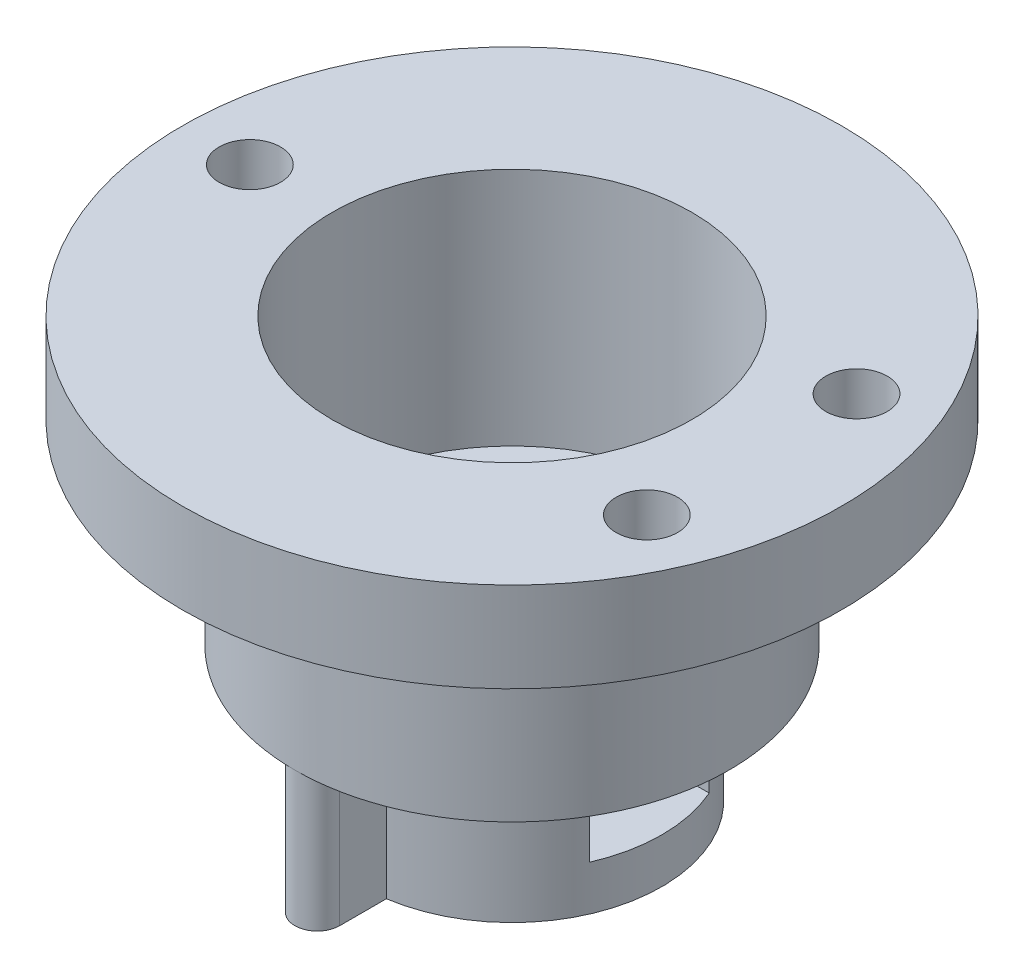
ISO-10303-21;
HEADER;
FILE_DESCRIPTION(('STEP AP214'),'2;1');
FILE_NAME('part.step','',(''),(''),'','','');
FILE_SCHEMA(('AUTOMOTIVE_DESIGN { 1 0 10303 214 1 1 1 1 }'));
ENDSEC;
DATA;
#1=APPLICATION_CONTEXT('core data for automotive mechanical design processes');
#2=APPLICATION_PROTOCOL_DEFINITION('international standard','automotive_design',2000,#1);
#3=PRODUCT_CONTEXT('',#1,'mechanical');
#4=PRODUCT('Part','Part','',(#3));
#5=PRODUCT_RELATED_PRODUCT_CATEGORY('part','',(#4));
#6=PRODUCT_DEFINITION_FORMATION('','',#4);
#7=PRODUCT_DEFINITION_CONTEXT('part definition',#1,'design');
#8=PRODUCT_DEFINITION('design','',#6,#7);
#9=PRODUCT_DEFINITION_SHAPE('','',#8);
#10=(LENGTH_UNIT() NAMED_UNIT(*) SI_UNIT(.MILLI.,.METRE.));
#11=(NAMED_UNIT(*) PLANE_ANGLE_UNIT() SI_UNIT($,.RADIAN.));
#12=(NAMED_UNIT(*) SI_UNIT($,.STERADIAN.) SOLID_ANGLE_UNIT());
#13=UNCERTAINTY_MEASURE_WITH_UNIT(LENGTH_MEASURE(1.E-05),#10,'distance_accuracy_value','');
#14=(GEOMETRIC_REPRESENTATION_CONTEXT(3) GLOBAL_UNCERTAINTY_ASSIGNED_CONTEXT((#13)) GLOBAL_UNIT_ASSIGNED_CONTEXT((#10,
#11,#12)) REPRESENTATION_CONTEXT('',''));
#15=CARTESIAN_POINT('',(0.,0.,0.));
#16=DIRECTION('',(0.,0.,1.));
#17=DIRECTION('',(1.,0.,0.));
#18=AXIS2_PLACEMENT_3D('',#15,#16,#17);
#19=CARTESIAN_POINT('',(0.,9.,0.));
#20=DIRECTION('',(0.,-1.,0.));
#21=DIRECTION('',(0.,0.,-1.));
#22=AXIS2_PLACEMENT_3D('',#19,#20,#21);
#23=CYLINDRICAL_SURFACE('',#22,10.);
#24=DIRECTION('',(0.,-1.,0.));
#25=VECTOR('',#24,1.);
#26=CARTESIAN_POINT('',(9.16515138991168,9.,4.));
#27=LINE('',#26,#25);
#28=CARTESIAN_POINT('',(9.16515138991168,3.,4.));
#29=VERTEX_POINT('',#28);
#30=CARTESIAN_POINT('',(9.16515138991168,6.8,4.));
#31=VERTEX_POINT('',#30);
#32=EDGE_CURVE('E11',#29,#31,#27,.F.);
#33=ORIENTED_EDGE('',*,*,#32,.T.);
#34=CARTESIAN_POINT('',(0.,6.8,0.));
#35=DIRECTION('',(0.,1.,0.));
#36=DIRECTION('',(0.,0.,1.));
#37=AXIS2_PLACEMENT_3D('',#34,#35,#36);
#38=CIRCLE('',#37,10.);
#39=CARTESIAN_POINT('',(9.16515138991168,6.8,-4.));
#40=VERTEX_POINT('',#39);
#41=EDGE_CURVE('E127',#31,#40,#38,.T.);
#42=ORIENTED_EDGE('',*,*,#41,.T.);
#43=DIRECTION('',(0.,-1.,0.));
#44=VECTOR('',#43,1.);
#45=CARTESIAN_POINT('',(9.16515138991168,9.,-4.));
#46=LINE('',#45,#44);
#47=CARTESIAN_POINT('',(9.16515138991168,3.,-4.));
#48=VERTEX_POINT('',#47);
#49=EDGE_CURVE('E42',#40,#48,#46,.T.);
#50=ORIENTED_EDGE('',*,*,#49,.T.);
#51=CARTESIAN_POINT('',(0.,3.,0.));
#52=DIRECTION('',(0.,1.,0.));
#53=DIRECTION('',(0.,0.,1.));
#54=AXIS2_PLACEMENT_3D('',#51,#52,#53);
#55=CIRCLE('',#54,10.);
#56=EDGE_CURVE('E128',#29,#48,#55,.T.);
#57=ORIENTED_EDGE('',*,*,#56,.F.);
#58=EDGE_LOOP('',(#33,#42,#50,#57));
#59=FACE_BOUND('',#58,.T.);
#60=DIRECTION('',(0.,-1.,0.));
#61=VECTOR('',#60,1.);
#62=CARTESIAN_POINT('',(-1.5,9.,9.88685996664259));
#63=LINE('',#62,#61);
#64=CARTESIAN_POINT('',(-1.5,9.,9.88685996664259));
#65=VERTEX_POINT('',#64);
#66=CARTESIAN_POINT('',(-1.5,0.,9.88685996664259));
#67=VERTEX_POINT('',#66);
#68=EDGE_CURVE('E186',#65,#67,#63,.T.);
#69=ORIENTED_EDGE('',*,*,#68,.F.);
#70=CARTESIAN_POINT('',(0.,9.,0.));
#71=DIRECTION('',(0.,1.,0.));
#72=DIRECTION('',(0.,0.,1.));
#73=AXIS2_PLACEMENT_3D('',#70,#71,#72);
#74=CIRCLE('',#73,10.);
#75=CARTESIAN_POINT('',(1.5,9.,9.88685996664259));
#76=VERTEX_POINT('',#75);
#77=EDGE_CURVE('E211',#76,#65,#74,.T.);
#78=ORIENTED_EDGE('',*,*,#77,.F.);
#79=DIRECTION('',(0.,-1.,0.));
#80=VECTOR('',#79,1.);
#81=CARTESIAN_POINT('',(1.5,9.,9.88685996664259));
#82=LINE('',#81,#80);
#83=CARTESIAN_POINT('',(1.5,0.,9.88685996664259));
#84=VERTEX_POINT('',#83);
#85=EDGE_CURVE('E184',#84,#76,#82,.F.);
#86=ORIENTED_EDGE('',*,*,#85,.F.);
#87=CARTESIAN_POINT('',(0.,0.,0.));
#88=DIRECTION('',(0.,1.,0.));
#89=DIRECTION('',(0.,0.,1.));
#90=AXIS2_PLACEMENT_3D('',#87,#88,#89);
#91=CIRCLE('',#90,10.);
#92=EDGE_CURVE('E208',#84,#67,#91,.T.);
#93=ORIENTED_EDGE('',*,*,#92,.T.);
#94=EDGE_LOOP('',(#69,#78,#86,#93));
#95=FACE_BOUND('',#94,.T.);
#96=ADVANCED_FACE('F34',(#59,#95),#23,.T.);
#97=CARTESIAN_POINT('',(0.,9.,0.));
#98=DIRECTION('',(0.,1.,0.));
#99=DIRECTION('',(0.,0.,1.));
#100=AXIS2_PLACEMENT_3D('',#97,#98,#99);
#101=PLANE('',#100);
#102=CARTESIAN_POINT('',(0.,9.,0.));
#103=DIRECTION('',(0.,1.,0.));
#104=DIRECTION('',(0.,0.,1.));
#105=AXIS2_PLACEMENT_3D('',#102,#103,#104);
#106=CIRCLE('',#105,14.5);
#107=CARTESIAN_POINT('',(0.,9.,14.5));
#108=VERTEX_POINT('',#107);
#109=EDGE_CURVE('E202',#108,#108,#106,.T.);
#110=ORIENTED_EDGE('',*,*,#109,.F.);
#111=CARTESIAN_POINT('',(0.,9.,13.));
#112=DIRECTION('',(0.,1.,0.));
#113=DIRECTION('',(0.,0.,1.));
#114=AXIS2_PLACEMENT_3D('',#111,#112,#113);
#115=CIRCLE('',#114,1.5);
#116=CARTESIAN_POINT('',(1.5,9.,13.));
#117=VERTEX_POINT('',#116);
#118=EDGE_CURVE('E167',#108,#117,#115,.T.);
#119=ORIENTED_EDGE('',*,*,#118,.T.);
#120=DIRECTION('',(0.,0.,-1.));
#121=VECTOR('',#120,1.);
#122=CARTESIAN_POINT('',(1.5,9.,13.));
#123=LINE('',#122,#121);
#124=EDGE_CURVE('E174',#117,#76,#123,.T.);
#125=ORIENTED_EDGE('',*,*,#124,.T.);
#126=ORIENTED_EDGE('',*,*,#77,.T.);
#127=DIRECTION('',(0.,0.,-1.));
#128=VECTOR('',#127,1.);
#129=CARTESIAN_POINT('',(-1.5,9.,13.));
#130=LINE('',#129,#128);
#131=CARTESIAN_POINT('',(-1.5,9.,13.));
#132=VERTEX_POINT('',#131);
#133=EDGE_CURVE('E182',#132,#65,#130,.T.);
#134=ORIENTED_EDGE('',*,*,#133,.F.);
#135=EDGE_CURVE('E165',#132,#108,#115,.T.);
#136=ORIENTED_EDGE('',*,*,#135,.T.);
#137=EDGE_LOOP('',(#110,#119,#125,#126,#134,#136));
#138=FACE_BOUND('',#137,.T.);
#139=ADVANCED_FACE('F245',(#138),#101,.F.);
#140=CARTESIAN_POINT('',(0.,-4.,0.));
#141=DIRECTION('',(0.,1.,0.));
#142=DIRECTION('',(0.,0.,1.));
#143=AXIS2_PLACEMENT_3D('',#140,#141,#142);
#144=CYLINDRICAL_SURFACE('',#143,3.);
#145=CARTESIAN_POINT('',(0.,0.,0.));
#146=DIRECTION('',(0.,1.,0.));
#147=DIRECTION('',(0.,0.,1.));
#148=AXIS2_PLACEMENT_3D('',#145,#146,#147);
#149=CIRCLE('',#148,3.);
#150=CARTESIAN_POINT('',(0.,0.,3.));
#151=VERTEX_POINT('',#150);
#152=EDGE_CURVE('E191',#151,#151,#149,.T.);
#153=ORIENTED_EDGE('',*,*,#152,.F.);
#154=EDGE_LOOP('',(#153));
#155=FACE_BOUND('',#154,.T.);
#156=CARTESIAN_POINT('',(0.,6.8,0.));
#157=DIRECTION('',(0.,1.,0.));
#158=DIRECTION('',(0.,0.,1.));
#159=AXIS2_PLACEMENT_3D('',#156,#157,#158);
#160=CIRCLE('',#159,3.);
#161=CARTESIAN_POINT('',(0.,6.8,-3.));
#162=VERTEX_POINT('',#161);
#163=CARTESIAN_POINT('',(0.,6.8,3.));
#164=VERTEX_POINT('',#163);
#165=EDGE_CURVE('E116',#162,#164,#160,.F.);
#166=ORIENTED_EDGE('',*,*,#165,.T.);
#167=DIRECTION('',(0.,1.,0.));
#168=VECTOR('',#167,1.);
#169=CARTESIAN_POINT('',(0.,-1.,3.));
#170=LINE('',#169,#168);
#171=CARTESIAN_POINT('',(0.,3.,3.));
#172=VERTEX_POINT('',#171);
#173=EDGE_CURVE('E120',#172,#164,#170,.T.);
#174=ORIENTED_EDGE('',*,*,#173,.F.);
#175=CARTESIAN_POINT('',(0.,3.,0.));
#176=DIRECTION('',(0.,1.,0.));
#177=DIRECTION('',(0.,0.,1.));
#178=AXIS2_PLACEMENT_3D('',#175,#176,#177);
#179=CIRCLE('',#178,3.);
#180=CARTESIAN_POINT('',(0.,3.,-3.));
#181=VERTEX_POINT('',#180);
#182=EDGE_CURVE('E50',#181,#172,#179,.F.);
#183=ORIENTED_EDGE('',*,*,#182,.F.);
#184=DIRECTION('',(0.,1.,0.));
#185=VECTOR('',#184,1.);
#186=CARTESIAN_POINT('',(0.,-4.,-3.));
#187=LINE('',#186,#185);
#188=EDGE_CURVE('E122',#181,#162,#187,.T.);
#189=ORIENTED_EDGE('',*,*,#188,.T.);
#190=EDGE_LOOP('',(#166,#174,#183,#189));
#191=FACE_BOUND('',#190,.T.);
#192=CARTESIAN_POINT('',(0.,12.,0.));
#193=DIRECTION('',(0.,1.,0.));
#194=DIRECTION('',(0.,0.,1.));
#195=AXIS2_PLACEMENT_3D('',#192,#193,#194);
#196=CIRCLE('',#195,3.);
#197=CARTESIAN_POINT('',(0.,12.,3.));
#198=VERTEX_POINT('',#197);
#199=EDGE_CURVE('E188',#198,#198,#196,.T.);
#200=ORIENTED_EDGE('',*,*,#199,.T.);
#201=EDGE_LOOP('',(#200));
#202=FACE_BOUND('',#201,.T.);
#203=ADVANCED_FACE('F118',(#155,#191,#202),#144,.F.);
#204=CARTESIAN_POINT('',(0.,0.,0.));
#205=DIRECTION('',(0.,1.,0.));
#206=DIRECTION('',(0.,0.,1.));
#207=AXIS2_PLACEMENT_3D('',#204,#205,#206);
#208=PLANE('',#207);
#209=ORIENTED_EDGE('',*,*,#152,.T.);
#210=EDGE_LOOP('',(#209));
#211=FACE_BOUND('',#210,.T.);
#212=ORIENTED_EDGE('',*,*,#92,.F.);
#213=DIRECTION('',(0.,0.,-1.));
#214=VECTOR('',#213,1.);
#215=CARTESIAN_POINT('',(1.5,0.,13.));
#216=LINE('',#215,#214);
#217=CARTESIAN_POINT('',(1.5,0.,13.));
#218=VERTEX_POINT('',#217);
#219=EDGE_CURVE('E177',#218,#84,#216,.T.);
#220=ORIENTED_EDGE('',*,*,#219,.F.);
#221=CARTESIAN_POINT('',(0.,0.,13.));
#222=DIRECTION('',(0.,-1.,0.));
#223=DIRECTION('',(0.,0.,-1.));
#224=AXIS2_PLACEMENT_3D('',#221,#222,#223);
#225=CIRCLE('',#224,1.5);
#226=CARTESIAN_POINT('',(-1.5,0.,13.));
#227=VERTEX_POINT('',#226);
#228=EDGE_CURVE('E162',#218,#227,#225,.T.);
#229=ORIENTED_EDGE('',*,*,#228,.T.);
#230=DIRECTION('',(0.,0.,-1.));
#231=VECTOR('',#230,1.);
#232=CARTESIAN_POINT('',(-1.5,0.,13.));
#233=LINE('',#232,#231);
#234=EDGE_CURVE('E179',#227,#67,#233,.T.);
#235=ORIENTED_EDGE('',*,*,#234,.T.);
#236=EDGE_LOOP('',(#212,#220,#229,#235));
#237=FACE_BOUND('',#236,.T.);
#238=ADVANCED_FACE('F271',(#211,#237),#208,.F.);
#239=CARTESIAN_POINT('',(0.,22.,0.));
#240=DIRECTION('',(0.,-1.,0.));
#241=DIRECTION('',(0.,0.,-1.));
#242=AXIS2_PLACEMENT_3D('',#239,#240,#241);
#243=CYLINDRICAL_SURFACE('',#242,14.5);
#244=ORIENTED_EDGE('',*,*,#109,.T.);
#245=EDGE_LOOP('',(#244));
#246=FACE_BOUND('',#245,.T.);
#247=CARTESIAN_POINT('',(0.,22.,0.));
#248=DIRECTION('',(0.,1.,0.));
#249=DIRECTION('',(0.,0.,1.));
#250=AXIS2_PLACEMENT_3D('',#247,#248,#249);
#251=CIRCLE('',#250,14.5);
#252=CARTESIAN_POINT('',(0.,22.,14.5));
#253=VERTEX_POINT('',#252);
#254=EDGE_CURVE('E205',#253,#253,#251,.T.);
#255=ORIENTED_EDGE('',*,*,#254,.F.);
#256=EDGE_LOOP('',(#255));
#257=FACE_BOUND('',#256,.T.);
#258=ADVANCED_FACE('F300',(#246,#257),#243,.T.);
#259=CARTESIAN_POINT('',(0.,28.,0.));
#260=DIRECTION('',(0.,-1.,0.));
#261=DIRECTION('',(0.,0.,-1.));
#262=AXIS2_PLACEMENT_3D('',#259,#260,#261);
#263=CYLINDRICAL_SURFACE('',#262,22.);
#264=CARTESIAN_POINT('',(0.,28.,0.));
#265=DIRECTION('',(0.,1.,0.));
#266=DIRECTION('',(0.,0.,1.));
#267=AXIS2_PLACEMENT_3D('',#264,#265,#266);
#268=CIRCLE('',#267,22.);
#269=CARTESIAN_POINT('',(0.,28.,22.));
#270=VERTEX_POINT('',#269);
#271=EDGE_CURVE('E199',#270,#270,#268,.T.);
#272=ORIENTED_EDGE('',*,*,#271,.F.);
#273=EDGE_LOOP('',(#272));
#274=FACE_BOUND('',#273,.T.);
#275=CARTESIAN_POINT('',(0.,22.,0.));
#276=DIRECTION('',(0.,1.,0.));
#277=DIRECTION('',(0.,0.,1.));
#278=AXIS2_PLACEMENT_3D('',#275,#276,#277);
#279=CIRCLE('',#278,22.);
#280=CARTESIAN_POINT('',(0.,22.,22.));
#281=VERTEX_POINT('',#280);
#282=EDGE_CURVE('E195',#281,#281,#279,.T.);
#283=ORIENTED_EDGE('',*,*,#282,.T.);
#284=EDGE_LOOP('',(#283));
#285=FACE_BOUND('',#284,.T.);
#286=ADVANCED_FACE('F295',(#274,#285),#263,.T.);
#287=CARTESIAN_POINT('',(0.,28.,0.));
#288=DIRECTION('',(0.,1.,0.));
#289=DIRECTION('',(0.,0.,1.));
#290=AXIS2_PLACEMENT_3D('',#287,#288,#289);
#291=PLANE('',#290);
#292=CARTESIAN_POINT('',(-17.5,28.,0.));
#293=DIRECTION('',(0.,1.,0.));
#294=DIRECTION('',(0.,0.,1.));
#295=AXIS2_PLACEMENT_3D('',#292,#293,#294);
#296=CIRCLE('',#295,2.05);
#297=CARTESIAN_POINT('',(-17.5,28.,2.05));
#298=VERTEX_POINT('',#297);
#299=EDGE_CURVE('E223',#298,#298,#296,.T.);
#300=ORIENTED_EDGE('',*,*,#299,.F.);
#301=EDGE_LOOP('',(#300));
#302=FACE_BOUND('',#301,.T.);
#303=CARTESIAN_POINT('',(15.999727997688,28.,-7.00000000000001));
#304=DIRECTION('',(0.,1.,0.));
#305=DIRECTION('',(0.,0.,1.));
#306=AXIS2_PLACEMENT_3D('',#303,#304,#305);
#307=CIRCLE('',#306,2.05);
#308=CARTESIAN_POINT('',(15.999727997688,28.,-4.95000000000001));
#309=VERTEX_POINT('',#308);
#310=EDGE_CURVE('E467',#309,#309,#307,.T.);
#311=ORIENTED_EDGE('',*,*,#310,.F.);
#312=EDGE_LOOP('',(#311));
#313=FACE_BOUND('',#312,.T.);
#314=CARTESIAN_POINT('',(15.999727997688,28.,6.99999999999999));
#315=DIRECTION('',(0.,1.,0.));
#316=DIRECTION('',(0.,0.,1.));
#317=AXIS2_PLACEMENT_3D('',#314,#315,#316);
#318=CIRCLE('',#317,2.05);
#319=CARTESIAN_POINT('',(15.999727997688,28.,9.04999999999999));
#320=VERTEX_POINT('',#319);
#321=EDGE_CURVE('E457',#320,#320,#318,.T.);
#322=ORIENTED_EDGE('',*,*,#321,.F.);
#323=EDGE_LOOP('',(#322));
#324=FACE_BOUND('',#323,.T.);
#325=CARTESIAN_POINT('',(0.,28.,0.));
#326=DIRECTION('',(0.,1.,0.));
#327=DIRECTION('',(0.,0.,1.));
#328=AXIS2_PLACEMENT_3D('',#325,#326,#327);
#329=CIRCLE('',#328,12.);
#330=CARTESIAN_POINT('',(0.,28.,12.));
#331=VERTEX_POINT('',#330);
#332=EDGE_CURVE('E196',#331,#331,#329,.T.);
#333=ORIENTED_EDGE('',*,*,#332,.F.);
#334=EDGE_LOOP('',(#333));
#335=FACE_BOUND('',#334,.T.);
#336=ORIENTED_EDGE('',*,*,#271,.T.);
#337=EDGE_LOOP('',(#336));
#338=FACE_BOUND('',#337,.T.);
#339=ADVANCED_FACE('F292',(#302,#313,#324,#335,#338),#291,.T.);
#340=CARTESIAN_POINT('',(0.,22.,0.));
#341=DIRECTION('',(0.,1.,0.));
#342=DIRECTION('',(0.,0.,1.));
#343=AXIS2_PLACEMENT_3D('',#340,#341,#342);
#344=PLANE('',#343);
#345=CARTESIAN_POINT('',(-17.5,22.,0.));
#346=DIRECTION('',(0.,1.,0.));
#347=DIRECTION('',(0.,0.,1.));
#348=AXIS2_PLACEMENT_3D('',#345,#346,#347);
#349=CIRCLE('',#348,2.05);
#350=CARTESIAN_POINT('',(-17.5,22.,2.05));
#351=VERTEX_POINT('',#350);
#352=EDGE_CURVE('E37',#351,#351,#349,.T.);
#353=ORIENTED_EDGE('',*,*,#352,.T.);
#354=EDGE_LOOP('',(#353));
#355=FACE_BOUND('',#354,.T.);
#356=CARTESIAN_POINT('',(15.999727997688,22.,-7.00000000000001));
#357=DIRECTION('',(0.,1.,0.));
#358=DIRECTION('',(0.,0.,1.));
#359=AXIS2_PLACEMENT_3D('',#356,#357,#358);
#360=CIRCLE('',#359,2.05);
#361=CARTESIAN_POINT('',(15.999727997688,22.,-4.95000000000001));
#362=VERTEX_POINT('',#361);
#363=EDGE_CURVE('E222',#362,#362,#360,.T.);
#364=ORIENTED_EDGE('',*,*,#363,.T.);
#365=EDGE_LOOP('',(#364));
#366=FACE_BOUND('',#365,.T.);
#367=CARTESIAN_POINT('',(15.999727997688,22.,6.99999999999999));
#368=DIRECTION('',(0.,1.,0.));
#369=DIRECTION('',(0.,0.,1.));
#370=AXIS2_PLACEMENT_3D('',#367,#368,#369);
#371=CIRCLE('',#370,2.05);
#372=CARTESIAN_POINT('',(15.999727997688,22.,9.04999999999999));
#373=VERTEX_POINT('',#372);
#374=EDGE_CURVE('E220',#373,#373,#371,.T.);
#375=ORIENTED_EDGE('',*,*,#374,.T.);
#376=EDGE_LOOP('',(#375));
#377=FACE_BOUND('',#376,.T.);
#378=ORIENTED_EDGE('',*,*,#254,.T.);
#379=EDGE_LOOP('',(#378));
#380=FACE_BOUND('',#379,.T.);
#381=ORIENTED_EDGE('',*,*,#282,.F.);
#382=EDGE_LOOP('',(#381));
#383=FACE_BOUND('',#382,.T.);
#384=ADVANCED_FACE('F230',(#355,#366,#377,#380,#383),#344,.F.);
#385=CARTESIAN_POINT('',(0.,12.,0.));
#386=DIRECTION('',(0.,1.,0.));
#387=DIRECTION('',(0.,0.,1.));
#388=AXIS2_PLACEMENT_3D('',#385,#386,#387);
#389=CYLINDRICAL_SURFACE('',#388,12.);
#390=CARTESIAN_POINT('',(0.,12.,0.));
#391=DIRECTION('',(0.,1.,0.));
#392=DIRECTION('',(0.,0.,1.));
#393=AXIS2_PLACEMENT_3D('',#390,#391,#392);
#394=CIRCLE('',#393,12.);
#395=CARTESIAN_POINT('',(0.,12.,12.));
#396=VERTEX_POINT('',#395);
#397=EDGE_CURVE('E192',#396,#396,#394,.T.);
#398=ORIENTED_EDGE('',*,*,#397,.F.);
#399=EDGE_LOOP('',(#398));
#400=FACE_BOUND('',#399,.T.);
#401=ORIENTED_EDGE('',*,*,#332,.T.);
#402=EDGE_LOOP('',(#401));
#403=FACE_BOUND('',#402,.T.);
#404=ADVANCED_FACE('F281',(#400,#403),#389,.F.);
#405=CARTESIAN_POINT('',(0.,12.,0.));
#406=DIRECTION('',(0.,1.,0.));
#407=DIRECTION('',(0.,0.,1.));
#408=AXIS2_PLACEMENT_3D('',#405,#406,#407);
#409=PLANE('',#408);
#410=ORIENTED_EDGE('',*,*,#199,.F.);
#411=EDGE_LOOP('',(#410));
#412=FACE_BOUND('',#411,.T.);
#413=ORIENTED_EDGE('',*,*,#397,.T.);
#414=EDGE_LOOP('',(#413));
#415=FACE_BOUND('',#414,.T.);
#416=ADVANCED_FACE('F274',(#412,#415),#409,.T.);
#417=CARTESIAN_POINT('',(-1.5,9.,13.));
#418=DIRECTION('',(1.,0.,0.));
#419=DIRECTION('',(0.,1.,0.));
#420=AXIS2_PLACEMENT_3D('',#417,#418,#419);
#421=PLANE('',#420);
#422=ORIENTED_EDGE('',*,*,#133,.T.);
#423=ORIENTED_EDGE('',*,*,#68,.T.);
#424=ORIENTED_EDGE('',*,*,#234,.F.);
#425=DIRECTION('',(0.,-1.,0.));
#426=VECTOR('',#425,1.);
#427=CARTESIAN_POINT('',(-1.5,9.,13.));
#428=LINE('',#427,#426);
#429=EDGE_CURVE('E168',#132,#227,#428,.T.);
#430=ORIENTED_EDGE('',*,*,#429,.F.);
#431=EDGE_LOOP('',(#422,#423,#424,#430));
#432=FACE_BOUND('',#431,.T.);
#433=ADVANCED_FACE('F272',(#432),#421,.F.);
#434=CARTESIAN_POINT('',(1.5,0.,13.));
#435=DIRECTION('',(-1.,0.,0.));
#436=DIRECTION('',(0.,-1.,0.));
#437=AXIS2_PLACEMENT_3D('',#434,#435,#436);
#438=PLANE('',#437);
#439=ORIENTED_EDGE('',*,*,#219,.T.);
#440=ORIENTED_EDGE('',*,*,#85,.T.);
#441=ORIENTED_EDGE('',*,*,#124,.F.);
#442=DIRECTION('',(0.,1.,0.));
#443=VECTOR('',#442,1.);
#444=CARTESIAN_POINT('',(1.5,0.,13.));
#445=LINE('',#444,#443);
#446=EDGE_CURVE('E171',#218,#117,#445,.T.);
#447=ORIENTED_EDGE('',*,*,#446,.F.);
#448=EDGE_LOOP('',(#439,#440,#441,#447));
#449=FACE_BOUND('',#448,.T.);
#450=ADVANCED_FACE('F265',(#449),#438,.F.);
#451=CARTESIAN_POINT('',(0.,13.,13.));
#452=DIRECTION('',(0.,-1.,0.));
#453=DIRECTION('',(0.,0.,-1.));
#454=AXIS2_PLACEMENT_3D('',#451,#452,#453);
#455=CYLINDRICAL_SURFACE('',#454,1.5);
#456=ORIENTED_EDGE('',*,*,#118,.F.);
#457=ORIENTED_EDGE('',*,*,#135,.F.);
#458=ORIENTED_EDGE('',*,*,#429,.T.);
#459=ORIENTED_EDGE('',*,*,#228,.F.);
#460=ORIENTED_EDGE('',*,*,#446,.T.);
#461=EDGE_LOOP('',(#456,#457,#458,#459,#460));
#462=FACE_BOUND('',#461,.T.);
#463=ADVANCED_FACE('F269',(#462),#455,.T.);
#464=CARTESIAN_POINT('',(13.,3.,4.));
#465=DIRECTION('',(0.,0.,1.));
#466=DIRECTION('',(0.,-1.,0.));
#467=AXIS2_PLACEMENT_3D('',#464,#465,#466);
#468=PLANE('',#467);
#469=DIRECTION('',(-1.,0.,0.));
#470=VECTOR('',#469,1.);
#471=CARTESIAN_POINT('',(13.,3.,4.));
#472=LINE('',#471,#470);
#473=CARTESIAN_POINT('',(0.,3.,4.));
#474=VERTEX_POINT('',#473);
#475=EDGE_CURVE('E153',#29,#474,#472,.T.);
#476=ORIENTED_EDGE('',*,*,#475,.T.);
#477=DIRECTION('',(0.,1.,0.));
#478=VECTOR('',#477,1.);
#479=CARTESIAN_POINT('',(0.,3.,4.));
#480=LINE('',#479,#478);
#481=CARTESIAN_POINT('',(0.,6.8,4.));
#482=VERTEX_POINT('',#481);
#483=EDGE_CURVE('E149',#474,#482,#480,.T.);
#484=ORIENTED_EDGE('',*,*,#483,.T.);
#485=DIRECTION('',(-1.,0.,0.));
#486=VECTOR('',#485,1.);
#487=CARTESIAN_POINT('',(13.,6.8,4.));
#488=LINE('',#487,#486);
#489=EDGE_CURVE('E141',#31,#482,#488,.T.);
#490=ORIENTED_EDGE('',*,*,#489,.F.);
#491=ORIENTED_EDGE('',*,*,#32,.F.);
#492=EDGE_LOOP('',(#476,#484,#490,#491));
#493=FACE_BOUND('',#492,.T.);
#494=ADVANCED_FACE('F380',(#493),#468,.F.);
#495=CARTESIAN_POINT('',(13.,6.8,-4.));
#496=DIRECTION('',(0.,0.,-1.));
#497=DIRECTION('',(0.,1.,0.));
#498=AXIS2_PLACEMENT_3D('',#495,#496,#497);
#499=PLANE('',#498);
#500=DIRECTION('',(-1.,0.,0.));
#501=VECTOR('',#500,1.);
#502=CARTESIAN_POINT('',(13.,6.8,-4.));
#503=LINE('',#502,#501);
#504=CARTESIAN_POINT('',(0.,6.8,-4.));
#505=VERTEX_POINT('',#504);
#506=EDGE_CURVE('E151',#40,#505,#503,.T.);
#507=ORIENTED_EDGE('',*,*,#506,.T.);
#508=DIRECTION('',(0.,-1.,0.));
#509=VECTOR('',#508,1.);
#510=CARTESIAN_POINT('',(0.,6.8,-4.));
#511=LINE('',#510,#509);
#512=CARTESIAN_POINT('',(0.,3.,-4.));
#513=VERTEX_POINT('',#512);
#514=EDGE_CURVE('E142',#505,#513,#511,.T.);
#515=ORIENTED_EDGE('',*,*,#514,.T.);
#516=DIRECTION('',(-1.,0.,0.));
#517=VECTOR('',#516,1.);
#518=CARTESIAN_POINT('',(13.,3.,-4.));
#519=LINE('',#518,#517);
#520=EDGE_CURVE('E58',#48,#513,#519,.T.);
#521=ORIENTED_EDGE('',*,*,#520,.F.);
#522=ORIENTED_EDGE('',*,*,#49,.F.);
#523=EDGE_LOOP('',(#507,#515,#521,#522));
#524=FACE_BOUND('',#523,.T.);
#525=ADVANCED_FACE('F388',(#524),#499,.F.);
#526=CARTESIAN_POINT('',(0.,0.,0.));
#527=DIRECTION('',(-1.,0.,0.));
#528=DIRECTION('',(0.,0.,1.));
#529=AXIS2_PLACEMENT_3D('',#526,#527,#528);
#530=PLANE('',#529);
#531=DIRECTION('',(0.,0.,-1.));
#532=VECTOR('',#531,1.);
#533=CARTESIAN_POINT('',(0.,3.,4.));
#534=LINE('',#533,#532);
#535=EDGE_CURVE('E144',#181,#513,#534,.T.);
#536=ORIENTED_EDGE('',*,*,#535,.T.);
#537=ORIENTED_EDGE('',*,*,#514,.F.);
#538=DIRECTION('',(0.,0.,-1.));
#539=VECTOR('',#538,1.);
#540=CARTESIAN_POINT('',(0.,6.8,4.));
#541=LINE('',#540,#539);
#542=EDGE_CURVE('E137',#162,#505,#541,.T.);
#543=ORIENTED_EDGE('',*,*,#542,.F.);
#544=ORIENTED_EDGE('',*,*,#188,.F.);
#545=EDGE_LOOP('',(#536,#537,#543,#544));
#546=FACE_BOUND('',#545,.T.);
#547=ADVANCED_FACE('F395',(#546),#530,.F.);
#548=EDGE_CURVE('E136',#474,#172,#534,.T.);
#549=ORIENTED_EDGE('',*,*,#548,.T.);
#550=ORIENTED_EDGE('',*,*,#173,.T.);
#551=EDGE_CURVE('E134',#482,#164,#541,.T.);
#552=ORIENTED_EDGE('',*,*,#551,.F.);
#553=ORIENTED_EDGE('',*,*,#483,.F.);
#554=EDGE_LOOP('',(#549,#550,#552,#553));
#555=FACE_BOUND('',#554,.T.);
#556=ADVANCED_FACE('F132',(#555),#530,.F.);
#557=CARTESIAN_POINT('',(13.,6.8,4.));
#558=DIRECTION('',(0.,1.,0.));
#559=DIRECTION('',(0.,0.,1.));
#560=AXIS2_PLACEMENT_3D('',#557,#558,#559);
#561=PLANE('',#560);
#562=ORIENTED_EDGE('',*,*,#551,.T.);
#563=ORIENTED_EDGE('',*,*,#165,.F.);
#564=ORIENTED_EDGE('',*,*,#542,.T.);
#565=ORIENTED_EDGE('',*,*,#506,.F.);
#566=ORIENTED_EDGE('',*,*,#41,.F.);
#567=ORIENTED_EDGE('',*,*,#489,.T.);
#568=EDGE_LOOP('',(#562,#563,#564,#565,#566,#567));
#569=FACE_BOUND('',#568,.T.);
#570=ADVANCED_FACE('F139',(#569),#561,.F.);
#571=CARTESIAN_POINT('',(13.,3.,4.));
#572=DIRECTION('',(0.,1.,0.));
#573=DIRECTION('',(0.,0.,1.));
#574=AXIS2_PLACEMENT_3D('',#571,#572,#573);
#575=PLANE('',#574);
#576=ORIENTED_EDGE('',*,*,#182,.T.);
#577=ORIENTED_EDGE('',*,*,#548,.F.);
#578=ORIENTED_EDGE('',*,*,#475,.F.);
#579=ORIENTED_EDGE('',*,*,#56,.T.);
#580=ORIENTED_EDGE('',*,*,#520,.T.);
#581=ORIENTED_EDGE('',*,*,#535,.F.);
#582=EDGE_LOOP('',(#576,#577,#578,#579,#580,#581));
#583=FACE_BOUND('',#582,.T.);
#584=ADVANCED_FACE('F413',(#583),#575,.T.);
#585=CARTESIAN_POINT('',(15.999727997688,15.,6.99999999999999));
#586=DIRECTION('',(0.,1.,0.));
#587=DIRECTION('',(0.,0.,1.));
#588=AXIS2_PLACEMENT_3D('',#585,#586,#587);
#589=CYLINDRICAL_SURFACE('',#588,2.05);
#590=CARTESIAN_POINT('',(15.999727997688,28.,9.04999999999999));
#591=CARTESIAN_POINT('',(15.999727997688,27.9375,9.04999999999999));
#592=CARTESIAN_POINT('',(15.999727997688,27.875,9.04999999999999));
#593=CARTESIAN_POINT('',(15.999727997688,27.75,9.04999999999999));
#594=CARTESIAN_POINT('',(15.999727997688,27.6875,9.04999999999999));
#595=CARTESIAN_POINT('',(15.999727997688,27.5625,9.04999999999999));
#596=CARTESIAN_POINT('',(15.999727997688,27.5,9.04999999999999));
#597=CARTESIAN_POINT('',(15.999727997688,27.375,9.04999999999999));
#598=CARTESIAN_POINT('',(15.999727997688,27.3125,9.04999999999999));
#599=CARTESIAN_POINT('',(15.999727997688,27.1875,9.04999999999999));
#600=CARTESIAN_POINT('',(15.999727997688,27.125,9.04999999999999));
#601=CARTESIAN_POINT('',(15.999727997688,27.,9.04999999999999));
#602=CARTESIAN_POINT('',(15.999727997688,26.9375,9.04999999999999));
#603=CARTESIAN_POINT('',(15.999727997688,26.8125,9.04999999999999));
#604=CARTESIAN_POINT('',(15.999727997688,26.75,9.04999999999999));
#605=CARTESIAN_POINT('',(15.999727997688,26.625,9.04999999999999));
#606=CARTESIAN_POINT('',(15.999727997688,26.5625,9.04999999999999));
#607=CARTESIAN_POINT('',(15.999727997688,26.4375,9.04999999999999));
#608=CARTESIAN_POINT('',(15.999727997688,26.375,9.04999999999999));
#609=CARTESIAN_POINT('',(15.999727997688,26.25,9.04999999999999));
#610=CARTESIAN_POINT('',(15.999727997688,26.1875,9.04999999999999));
#611=CARTESIAN_POINT('',(15.999727997688,26.0625,9.04999999999999));
#612=CARTESIAN_POINT('',(15.999727997688,26.,9.04999999999999));
#613=CARTESIAN_POINT('',(15.999727997688,25.875,9.04999999999999));
#614=CARTESIAN_POINT('',(15.999727997688,25.8125,9.04999999999999));
#615=CARTESIAN_POINT('',(15.999727997688,25.6875,9.04999999999999));
#616=CARTESIAN_POINT('',(15.999727997688,25.625,9.04999999999999));
#617=CARTESIAN_POINT('',(15.999727997688,25.5,9.04999999999999));
#618=CARTESIAN_POINT('',(15.999727997688,25.4375,9.04999999999999));
#619=CARTESIAN_POINT('',(15.999727997688,25.3125,9.04999999999999));
#620=CARTESIAN_POINT('',(15.999727997688,25.25,9.04999999999999));
#621=CARTESIAN_POINT('',(15.999727997688,25.125,9.04999999999999));
#622=CARTESIAN_POINT('',(15.999727997688,25.0625,9.04999999999999));
#623=CARTESIAN_POINT('',(15.999727997688,24.9375,9.04999999999999));
#624=CARTESIAN_POINT('',(15.999727997688,24.875,9.04999999999999));
#625=CARTESIAN_POINT('',(15.999727997688,24.75,9.04999999999999));
#626=CARTESIAN_POINT('',(15.999727997688,24.6875,9.04999999999999));
#627=CARTESIAN_POINT('',(15.999727997688,24.5625,9.04999999999999));
#628=CARTESIAN_POINT('',(15.999727997688,24.5,9.04999999999999));
#629=CARTESIAN_POINT('',(15.999727997688,24.375,9.04999999999999));
#630=CARTESIAN_POINT('',(15.999727997688,24.3125,9.04999999999999));
#631=CARTESIAN_POINT('',(15.999727997688,24.1875,9.04999999999999));
#632=CARTESIAN_POINT('',(15.999727997688,24.125,9.04999999999999));
#633=CARTESIAN_POINT('',(15.999727997688,24.,9.04999999999999));
#634=CARTESIAN_POINT('',(15.999727997688,23.9375,9.04999999999999));
#635=CARTESIAN_POINT('',(15.999727997688,23.8125,9.04999999999999));
#636=CARTESIAN_POINT('',(15.999727997688,23.75,9.04999999999999));
#637=CARTESIAN_POINT('',(15.999727997688,23.625,9.04999999999999));
#638=CARTESIAN_POINT('',(15.999727997688,23.5625,9.04999999999999));
#639=CARTESIAN_POINT('',(15.999727997688,23.4375,9.04999999999999));
#640=CARTESIAN_POINT('',(15.999727997688,23.375,9.04999999999999));
#641=CARTESIAN_POINT('',(15.999727997688,23.25,9.04999999999999));
#642=CARTESIAN_POINT('',(15.999727997688,23.1875,9.04999999999999));
#643=CARTESIAN_POINT('',(15.999727997688,23.0625,9.04999999999999));
#644=CARTESIAN_POINT('',(15.999727997688,23.,9.04999999999999));
#645=CARTESIAN_POINT('',(15.999727997688,22.875,9.04999999999999));
#646=CARTESIAN_POINT('',(15.999727997688,22.8125,9.04999999999999));
#647=CARTESIAN_POINT('',(15.999727997688,22.6875,9.04999999999999));
#648=CARTESIAN_POINT('',(15.999727997688,22.625,9.04999999999999));
#649=CARTESIAN_POINT('',(15.999727997688,22.5,9.04999999999999));
#650=CARTESIAN_POINT('',(15.999727997688,22.4375,9.04999999999999));
#651=CARTESIAN_POINT('',(15.999727997688,22.3125,9.04999999999999));
#652=CARTESIAN_POINT('',(15.999727997688,22.25,9.04999999999999));
#653=CARTESIAN_POINT('',(15.999727997688,22.125,9.04999999999999));
#654=CARTESIAN_POINT('',(15.999727997688,22.0625,9.04999999999999));
#655=CARTESIAN_POINT('',(15.999727997688,22.,9.04999999999999));
#656=B_SPLINE_CURVE_WITH_KNOTS('',3,(#590,#591,#592,#593,#594,#595,#596,#597,#598,#599,#600,
#601,#602,#603,#604,#605,#606,#607,#608,#609,#610,#611,#612,#613,#614,#615,#616,#617,#618,#619,
#620,#621,#622,#623,#624,#625,#626,#627,#628,#629,#630,#631,#632,#633,#634,#635,#636,#637,#638,
#639,#640,#641,#642,#643,#644,#645,#646,#647,#648,#649,#650,#651,#652,#653,#654,#655),
.UNSPECIFIED.,.F.,.F.,(4,2,2,2,2,2,2,2,2,2,2,2,2,2,2,2,2,2,2,2,2,2,2,2,2,2,2,2,2,2,2,2,4),(0.,
0.1875,0.375,0.5625,0.750000000000001,0.937499999999997,1.125,1.3125,1.5,1.6875,1.875,2.0625,
2.25,2.4375,2.625,2.8125,3.,3.1875,3.375,3.5625,3.75,3.9375,4.125,4.3125,4.5,4.6875,4.875,
5.0625,5.25,5.4375,5.625,5.8125,6.),.UNSPECIFIED.);
#657=EDGE_CURVE('BSEAM240',#320,#373,#656,.T.);
#658=ORIENTED_EDGE('',*,*,#321,.T.);
#659=ORIENTED_EDGE('',*,*,#374,.F.);
#660=ORIENTED_EDGE('',*,*,#657,.T.);
#661=ORIENTED_EDGE('',*,*,#657,.F.);
#662=EDGE_LOOP('',(#658,#660,#659,#661));
#663=FACE_BOUND('',#662,.T.);
#664=ADVANCED_FACE('F240',(#663),#589,.F.);
#665=CARTESIAN_POINT('',(15.999727997688,15.,-7.00000000000001));
#666=DIRECTION('',(0.,1.,0.));
#667=DIRECTION('',(0.,0.,1.));
#668=AXIS2_PLACEMENT_3D('',#665,#666,#667);
#669=CYLINDRICAL_SURFACE('',#668,2.05);
#670=CARTESIAN_POINT('',(15.999727997688,28.,-4.95000000000001));
#671=CARTESIAN_POINT('',(15.999727997688,27.9375,-4.95000000000001));
#672=CARTESIAN_POINT('',(15.999727997688,27.875,-4.95000000000001));
#673=CARTESIAN_POINT('',(15.999727997688,27.75,-4.95000000000001));
#674=CARTESIAN_POINT('',(15.999727997688,27.6875,-4.95000000000001));
#675=CARTESIAN_POINT('',(15.999727997688,27.5625,-4.95000000000001));
#676=CARTESIAN_POINT('',(15.999727997688,27.5,-4.95000000000001));
#677=CARTESIAN_POINT('',(15.999727997688,27.375,-4.95000000000001));
#678=CARTESIAN_POINT('',(15.999727997688,27.3125,-4.95000000000001));
#679=CARTESIAN_POINT('',(15.999727997688,27.1875,-4.95000000000001));
#680=CARTESIAN_POINT('',(15.999727997688,27.125,-4.95000000000001));
#681=CARTESIAN_POINT('',(15.999727997688,27.,-4.95000000000001));
#682=CARTESIAN_POINT('',(15.999727997688,26.9375,-4.95000000000001));
#683=CARTESIAN_POINT('',(15.999727997688,26.8125,-4.95000000000001));
#684=CARTESIAN_POINT('',(15.999727997688,26.75,-4.95000000000001));
#685=CARTESIAN_POINT('',(15.999727997688,26.625,-4.95000000000001));
#686=CARTESIAN_POINT('',(15.999727997688,26.5625,-4.95000000000001));
#687=CARTESIAN_POINT('',(15.999727997688,26.4375,-4.95000000000001));
#688=CARTESIAN_POINT('',(15.999727997688,26.375,-4.95000000000001));
#689=CARTESIAN_POINT('',(15.999727997688,26.25,-4.95000000000001));
#690=CARTESIAN_POINT('',(15.999727997688,26.1875,-4.95000000000001));
#691=CARTESIAN_POINT('',(15.999727997688,26.0625,-4.95000000000001));
#692=CARTESIAN_POINT('',(15.999727997688,26.,-4.95000000000001));
#693=CARTESIAN_POINT('',(15.999727997688,25.875,-4.95000000000001));
#694=CARTESIAN_POINT('',(15.999727997688,25.8125,-4.95000000000001));
#695=CARTESIAN_POINT('',(15.999727997688,25.6875,-4.95000000000001));
#696=CARTESIAN_POINT('',(15.999727997688,25.625,-4.95000000000001));
#697=CARTESIAN_POINT('',(15.999727997688,25.5,-4.95000000000001));
#698=CARTESIAN_POINT('',(15.999727997688,25.4375,-4.95000000000001));
#699=CARTESIAN_POINT('',(15.999727997688,25.3125,-4.95000000000001));
#700=CARTESIAN_POINT('',(15.999727997688,25.25,-4.95000000000001));
#701=CARTESIAN_POINT('',(15.999727997688,25.125,-4.95000000000001));
#702=CARTESIAN_POINT('',(15.999727997688,25.0625,-4.95000000000001));
#703=CARTESIAN_POINT('',(15.999727997688,24.9375,-4.95000000000001));
#704=CARTESIAN_POINT('',(15.999727997688,24.875,-4.95000000000001));
#705=CARTESIAN_POINT('',(15.999727997688,24.75,-4.95000000000001));
#706=CARTESIAN_POINT('',(15.999727997688,24.6875,-4.95000000000001));
#707=CARTESIAN_POINT('',(15.999727997688,24.5625,-4.95000000000001));
#708=CARTESIAN_POINT('',(15.999727997688,24.5,-4.95000000000001));
#709=CARTESIAN_POINT('',(15.999727997688,24.375,-4.95000000000001));
#710=CARTESIAN_POINT('',(15.999727997688,24.3125,-4.95000000000001));
#711=CARTESIAN_POINT('',(15.999727997688,24.1875,-4.95000000000001));
#712=CARTESIAN_POINT('',(15.999727997688,24.125,-4.95000000000001));
#713=CARTESIAN_POINT('',(15.999727997688,24.,-4.95000000000001));
#714=CARTESIAN_POINT('',(15.999727997688,23.9375,-4.95000000000001));
#715=CARTESIAN_POINT('',(15.999727997688,23.8125,-4.95000000000001));
#716=CARTESIAN_POINT('',(15.999727997688,23.75,-4.95000000000001));
#717=CARTESIAN_POINT('',(15.999727997688,23.625,-4.95000000000001));
#718=CARTESIAN_POINT('',(15.999727997688,23.5625,-4.95000000000001));
#719=CARTESIAN_POINT('',(15.999727997688,23.4375,-4.95000000000001));
#720=CARTESIAN_POINT('',(15.999727997688,23.375,-4.95000000000001));
#721=CARTESIAN_POINT('',(15.999727997688,23.25,-4.95000000000001));
#722=CARTESIAN_POINT('',(15.999727997688,23.1875,-4.95000000000001));
#723=CARTESIAN_POINT('',(15.999727997688,23.0625,-4.95000000000001));
#724=CARTESIAN_POINT('',(15.999727997688,23.,-4.95000000000001));
#725=CARTESIAN_POINT('',(15.999727997688,22.875,-4.95000000000001));
#726=CARTESIAN_POINT('',(15.999727997688,22.8125,-4.95000000000001));
#727=CARTESIAN_POINT('',(15.999727997688,22.6875,-4.95000000000001));
#728=CARTESIAN_POINT('',(15.999727997688,22.625,-4.95000000000001));
#729=CARTESIAN_POINT('',(15.999727997688,22.5,-4.95000000000001));
#730=CARTESIAN_POINT('',(15.999727997688,22.4375,-4.95000000000001));
#731=CARTESIAN_POINT('',(15.999727997688,22.3125,-4.95000000000001));
#732=CARTESIAN_POINT('',(15.999727997688,22.25,-4.95000000000001));
#733=CARTESIAN_POINT('',(15.999727997688,22.125,-4.95000000000001));
#734=CARTESIAN_POINT('',(15.999727997688,22.0625,-4.95000000000001));
#735=CARTESIAN_POINT('',(15.999727997688,22.,-4.95000000000001));
#736=B_SPLINE_CURVE_WITH_KNOTS('',3,(#670,#671,#672,#673,#674,#675,#676,#677,#678,#679,#680,
#681,#682,#683,#684,#685,#686,#687,#688,#689,#690,#691,#692,#693,#694,#695,#696,#697,#698,#699,
#700,#701,#702,#703,#704,#705,#706,#707,#708,#709,#710,#711,#712,#713,#714,#715,#716,#717,#718,
#719,#720,#721,#722,#723,#724,#725,#726,#727,#728,#729,#730,#731,#732,#733,#734,#735),
.UNSPECIFIED.,.F.,.F.,(4,2,2,2,2,2,2,2,2,2,2,2,2,2,2,2,2,2,2,2,2,2,2,2,2,2,2,2,2,2,2,2,4),(0.,
0.1875,0.375,0.5625,0.750000000000001,0.937499999999997,1.125,1.3125,1.5,1.6875,1.875,2.0625,
2.25,2.4375,2.625,2.8125,3.,3.1875,3.375,3.5625,3.75,3.9375,4.125,4.3125,4.5,4.6875,4.875,
5.0625,5.25,5.4375,5.625,5.8125,6.),.UNSPECIFIED.);
#737=EDGE_CURVE('BSEAM234',#309,#362,#736,.T.);
#738=ORIENTED_EDGE('',*,*,#310,.T.);
#739=ORIENTED_EDGE('',*,*,#363,.F.);
#740=ORIENTED_EDGE('',*,*,#737,.T.);
#741=ORIENTED_EDGE('',*,*,#737,.F.);
#742=EDGE_LOOP('',(#738,#740,#739,#741));
#743=FACE_BOUND('',#742,.T.);
#744=ADVANCED_FACE('F234',(#743),#669,.F.);
#745=CARTESIAN_POINT('',(-17.5,15.,0.));
#746=DIRECTION('',(0.,1.,0.));
#747=DIRECTION('',(0.,0.,1.));
#748=AXIS2_PLACEMENT_3D('',#745,#746,#747);
#749=CYLINDRICAL_SURFACE('',#748,2.05);
#750=CARTESIAN_POINT('',(-17.5,28.,2.05));
#751=CARTESIAN_POINT('',(-17.5,27.9375,2.05));
#752=CARTESIAN_POINT('',(-17.5,27.875,2.05));
#753=CARTESIAN_POINT('',(-17.5,27.75,2.05));
#754=CARTESIAN_POINT('',(-17.5,27.6875,2.05));
#755=CARTESIAN_POINT('',(-17.5,27.5625,2.05));
#756=CARTESIAN_POINT('',(-17.5,27.5,2.05));
#757=CARTESIAN_POINT('',(-17.5,27.375,2.05));
#758=CARTESIAN_POINT('',(-17.5,27.3125,2.05));
#759=CARTESIAN_POINT('',(-17.5,27.1875,2.05));
#760=CARTESIAN_POINT('',(-17.5,27.125,2.05));
#761=CARTESIAN_POINT('',(-17.5,27.,2.05));
#762=CARTESIAN_POINT('',(-17.5,26.9375,2.05));
#763=CARTESIAN_POINT('',(-17.5,26.8125,2.05));
#764=CARTESIAN_POINT('',(-17.5,26.75,2.05));
#765=CARTESIAN_POINT('',(-17.5,26.625,2.05));
#766=CARTESIAN_POINT('',(-17.5,26.5625,2.05));
#767=CARTESIAN_POINT('',(-17.5,26.4375,2.05));
#768=CARTESIAN_POINT('',(-17.5,26.375,2.05));
#769=CARTESIAN_POINT('',(-17.5,26.25,2.05));
#770=CARTESIAN_POINT('',(-17.5,26.1875,2.05));
#771=CARTESIAN_POINT('',(-17.5,26.0625,2.05));
#772=CARTESIAN_POINT('',(-17.5,26.,2.05));
#773=CARTESIAN_POINT('',(-17.5,25.875,2.05));
#774=CARTESIAN_POINT('',(-17.5,25.8125,2.05));
#775=CARTESIAN_POINT('',(-17.5,25.6875,2.05));
#776=CARTESIAN_POINT('',(-17.5,25.625,2.05));
#777=CARTESIAN_POINT('',(-17.5,25.5,2.05));
#778=CARTESIAN_POINT('',(-17.5,25.4375,2.05));
#779=CARTESIAN_POINT('',(-17.5,25.3125,2.05));
#780=CARTESIAN_POINT('',(-17.5,25.25,2.05));
#781=CARTESIAN_POINT('',(-17.5,25.125,2.05));
#782=CARTESIAN_POINT('',(-17.5,25.0625,2.05));
#783=CARTESIAN_POINT('',(-17.5,24.9375,2.05));
#784=CARTESIAN_POINT('',(-17.5,24.875,2.05));
#785=CARTESIAN_POINT('',(-17.5,24.75,2.05));
#786=CARTESIAN_POINT('',(-17.5,24.6875,2.05));
#787=CARTESIAN_POINT('',(-17.5,24.5625,2.05));
#788=CARTESIAN_POINT('',(-17.5,24.5,2.05));
#789=CARTESIAN_POINT('',(-17.5,24.375,2.05));
#790=CARTESIAN_POINT('',(-17.5,24.3125,2.05));
#791=CARTESIAN_POINT('',(-17.5,24.1875,2.05));
#792=CARTESIAN_POINT('',(-17.5,24.125,2.05));
#793=CARTESIAN_POINT('',(-17.5,24.,2.05));
#794=CARTESIAN_POINT('',(-17.5,23.9375,2.05));
#795=CARTESIAN_POINT('',(-17.5,23.8125,2.05));
#796=CARTESIAN_POINT('',(-17.5,23.75,2.05));
#797=CARTESIAN_POINT('',(-17.5,23.625,2.05));
#798=CARTESIAN_POINT('',(-17.5,23.5625,2.05));
#799=CARTESIAN_POINT('',(-17.5,23.4375,2.05));
#800=CARTESIAN_POINT('',(-17.5,23.375,2.05));
#801=CARTESIAN_POINT('',(-17.5,23.25,2.05));
#802=CARTESIAN_POINT('',(-17.5,23.1875,2.05));
#803=CARTESIAN_POINT('',(-17.5,23.0625,2.05));
#804=CARTESIAN_POINT('',(-17.5,23.,2.05));
#805=CARTESIAN_POINT('',(-17.5,22.875,2.05));
#806=CARTESIAN_POINT('',(-17.5,22.8125,2.05));
#807=CARTESIAN_POINT('',(-17.5,22.6875,2.05));
#808=CARTESIAN_POINT('',(-17.5,22.625,2.05));
#809=CARTESIAN_POINT('',(-17.5,22.5,2.05));
#810=CARTESIAN_POINT('',(-17.5,22.4375,2.05));
#811=CARTESIAN_POINT('',(-17.5,22.3125,2.05));
#812=CARTESIAN_POINT('',(-17.5,22.25,2.05));
#813=CARTESIAN_POINT('',(-17.5,22.125,2.05));
#814=CARTESIAN_POINT('',(-17.5,22.0625,2.05));
#815=CARTESIAN_POINT('',(-17.5,22.,2.05));
#816=B_SPLINE_CURVE_WITH_KNOTS('',3,(#750,#751,#752,#753,#754,#755,#756,#757,#758,#759,#760,
#761,#762,#763,#764,#765,#766,#767,#768,#769,#770,#771,#772,#773,#774,#775,#776,#777,#778,#779,
#780,#781,#782,#783,#784,#785,#786,#787,#788,#789,#790,#791,#792,#793,#794,#795,#796,#797,#798,
#799,#800,#801,#802,#803,#804,#805,#806,#807,#808,#809,#810,#811,#812,#813,#814,#815),
.UNSPECIFIED.,.F.,.F.,(4,2,2,2,2,2,2,2,2,2,2,2,2,2,2,2,2,2,2,2,2,2,2,2,2,2,2,2,2,2,2,2,4),(0.,
0.1875,0.375,0.5625,0.750000000000001,0.937499999999997,1.125,1.3125,1.5,1.6875,1.875,2.0625,
2.25,2.4375,2.625,2.8125,3.,3.1875,3.375,3.5625,3.75,3.9375,4.125,4.3125,4.5,4.6875,4.875,
5.0625,5.25,5.4375,5.625,5.8125,6.),.UNSPECIFIED.);
#817=EDGE_CURVE('BSEAM232',#298,#351,#816,.T.);
#818=ORIENTED_EDGE('',*,*,#299,.T.);
#819=ORIENTED_EDGE('',*,*,#352,.F.);
#820=ORIENTED_EDGE('',*,*,#817,.T.);
#821=ORIENTED_EDGE('',*,*,#817,.F.);
#822=EDGE_LOOP('',(#818,#820,#819,#821));
#823=FACE_BOUND('',#822,.T.);
#824=ADVANCED_FACE('F232',(#823),#749,.F.);
#825=CLOSED_SHELL('',(#96,#139,#203,#238,#258,#286,#339,#384,#404,#416,#433,#450,#463,#494,#525,
#547,#556,#570,#584,#664,#744,#824));
#826=MANIFOLD_SOLID_BREP('B2',#825);
#827=ADVANCED_BREP_SHAPE_REPRESENTATION('',(#18,#826),#14);
#828=SHAPE_DEFINITION_REPRESENTATION(#9,#827);
ENDSEC;
END-ISO-10303-21;
